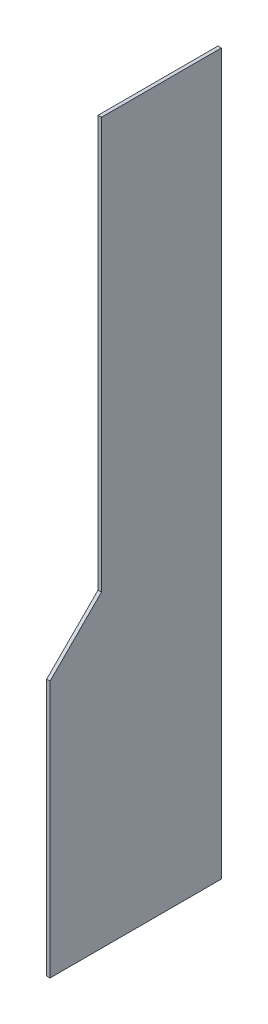
ISO-10303-21;
HEADER;
FILE_DESCRIPTION(('STEP AP214'),'2;1');
FILE_NAME('part.step','',(''),(''),'','','');
FILE_SCHEMA(('AUTOMOTIVE_DESIGN { 1 0 10303 214 1 1 1 1 }'));
ENDSEC;
DATA;
#1=APPLICATION_CONTEXT('core data for automotive mechanical design processes');
#2=APPLICATION_PROTOCOL_DEFINITION('international standard','automotive_design',2000,#1);
#3=PRODUCT_CONTEXT('',#1,'mechanical');
#4=PRODUCT('Part','Part','',(#3));
#5=PRODUCT_RELATED_PRODUCT_CATEGORY('part','',(#4));
#6=PRODUCT_DEFINITION_FORMATION('','',#4);
#7=PRODUCT_DEFINITION_CONTEXT('part definition',#1,'design');
#8=PRODUCT_DEFINITION('design','',#6,#7);
#9=PRODUCT_DEFINITION_SHAPE('','',#8);
#10=(LENGTH_UNIT() NAMED_UNIT(*) SI_UNIT(.MILLI.,.METRE.));
#11=(NAMED_UNIT(*) PLANE_ANGLE_UNIT() SI_UNIT($,.RADIAN.));
#12=(NAMED_UNIT(*) SI_UNIT($,.STERADIAN.) SOLID_ANGLE_UNIT());
#13=UNCERTAINTY_MEASURE_WITH_UNIT(LENGTH_MEASURE(1.E-05),#10,'distance_accuracy_value','');
#14=(GEOMETRIC_REPRESENTATION_CONTEXT(3) GLOBAL_UNCERTAINTY_ASSIGNED_CONTEXT((#13)) GLOBAL_UNIT_ASSIGNED_CONTEXT((#10,
#11,#12)) REPRESENTATION_CONTEXT('',''));
#15=CARTESIAN_POINT('',(0.,0.,0.));
#16=DIRECTION('',(0.,0.,1.));
#17=DIRECTION('',(1.,0.,0.));
#18=AXIS2_PLACEMENT_3D('',#15,#16,#17);
#19=CARTESIAN_POINT('',(10.,0.,0.));
#20=DIRECTION('',(0.,0.,-1.));
#21=DIRECTION('',(-1.,0.,0.));
#22=AXIS2_PLACEMENT_3D('',#19,#20,#21);
#23=PLANE('',#22);
#24=DIRECTION('',(0.,-1.,0.));
#25=VECTOR('',#24,1.);
#26=CARTESIAN_POINT('',(0.,0.,0.));
#27=LINE('',#26,#25);
#28=CARTESIAN_POINT('',(0.,750.,0.));
#29=VERTEX_POINT('',#28);
#30=CARTESIAN_POINT('',(0.,0.,0.));
#31=VERTEX_POINT('',#30);
#32=EDGE_CURVE('E118',#29,#31,#27,.T.);
#33=ORIENTED_EDGE('',*,*,#32,.T.);
#34=DIRECTION('',(-1.,0.,0.));
#35=VECTOR('',#34,1.);
#36=CARTESIAN_POINT('',(10.,0.,0.));
#37=LINE('',#36,#35);
#38=CARTESIAN_POINT('',(10.,0.,0.));
#39=VERTEX_POINT('',#38);
#40=EDGE_CURVE('E11',#39,#31,#37,.T.);
#41=ORIENTED_EDGE('',*,*,#40,.F.);
#42=DIRECTION('',(0.,-1.,0.));
#43=VECTOR('',#42,1.);
#44=CARTESIAN_POINT('',(10.,0.,0.));
#45=LINE('',#44,#43);
#46=CARTESIAN_POINT('',(10.,750.,0.));
#47=VERTEX_POINT('',#46);
#48=EDGE_CURVE('E129',#47,#39,#45,.T.);
#49=ORIENTED_EDGE('',*,*,#48,.F.);
#50=DIRECTION('',(-1.,0.,0.));
#51=VECTOR('',#50,1.);
#52=CARTESIAN_POINT('',(10.,750.,0.));
#53=LINE('',#52,#51);
#54=EDGE_CURVE('E114',#47,#29,#53,.T.);
#55=ORIENTED_EDGE('',*,*,#54,.T.);
#56=EDGE_LOOP('',(#33,#41,#49,#55));
#57=FACE_BOUND('',#56,.T.);
#58=ADVANCED_FACE('F35',(#57),#23,.F.);
#59=CARTESIAN_POINT('',(10.,0.,0.));
#60=DIRECTION('',(0.,1.,0.));
#61=DIRECTION('',(0.,0.,1.));
#62=AXIS2_PLACEMENT_3D('',#59,#60,#61);
#63=PLANE('',#62);
#64=DIRECTION('',(0.,0.,-1.));
#65=VECTOR('',#64,1.);
#66=CARTESIAN_POINT('',(0.,0.,0.));
#67=LINE('',#66,#65);
#68=CARTESIAN_POINT('',(0.,0.,-500.));
#69=VERTEX_POINT('',#68);
#70=EDGE_CURVE('E121',#31,#69,#67,.T.);
#71=ORIENTED_EDGE('',*,*,#70,.T.);
#72=DIRECTION('',(-1.,0.,0.));
#73=VECTOR('',#72,1.);
#74=CARTESIAN_POINT('',(10.,0.,-500.));
#75=LINE('',#74,#73);
#76=CARTESIAN_POINT('',(10.,0.,-500.));
#77=VERTEX_POINT('',#76);
#78=EDGE_CURVE('E43',#77,#69,#75,.T.);
#79=ORIENTED_EDGE('',*,*,#78,.F.);
#80=DIRECTION('',(0.,0.,-1.));
#81=VECTOR('',#80,1.);
#82=CARTESIAN_POINT('',(10.,0.,0.));
#83=LINE('',#82,#81);
#84=EDGE_CURVE('E87',#39,#77,#83,.T.);
#85=ORIENTED_EDGE('',*,*,#84,.F.);
#86=ORIENTED_EDGE('',*,*,#40,.T.);
#87=EDGE_LOOP('',(#71,#79,#85,#86));
#88=FACE_BOUND('',#87,.T.);
#89=ADVANCED_FACE('F153',(#88),#63,.F.);
#90=CARTESIAN_POINT('',(10.,0.,-500.));
#91=DIRECTION('',(0.,0.,1.));
#92=DIRECTION('',(1.,0.,0.));
#93=AXIS2_PLACEMENT_3D('',#90,#91,#92);
#94=PLANE('',#93);
#95=DIRECTION('',(0.,1.,0.));
#96=VECTOR('',#95,1.);
#97=CARTESIAN_POINT('',(0.,0.,-500.));
#98=LINE('',#97,#96);
#99=CARTESIAN_POINT('',(0.,2100.,-500.));
#100=VERTEX_POINT('',#99);
#101=EDGE_CURVE('E123',#69,#100,#98,.T.);
#102=ORIENTED_EDGE('',*,*,#101,.T.);
#103=DIRECTION('',(-1.,0.,0.));
#104=VECTOR('',#103,1.);
#105=CARTESIAN_POINT('',(10.,2100.,-500.));
#106=LINE('',#105,#104);
#107=CARTESIAN_POINT('',(10.,2100.,-500.));
#108=VERTEX_POINT('',#107);
#109=EDGE_CURVE('E109',#108,#100,#106,.T.);
#110=ORIENTED_EDGE('',*,*,#109,.F.);
#111=DIRECTION('',(0.,1.,0.));
#112=VECTOR('',#111,1.);
#113=CARTESIAN_POINT('',(10.,0.,-500.));
#114=LINE('',#113,#112);
#115=EDGE_CURVE('E100',#77,#108,#114,.T.);
#116=ORIENTED_EDGE('',*,*,#115,.F.);
#117=ORIENTED_EDGE('',*,*,#78,.T.);
#118=EDGE_LOOP('',(#102,#110,#116,#117));
#119=FACE_BOUND('',#118,.T.);
#120=ADVANCED_FACE('F135',(#119),#94,.F.);
#121=CARTESIAN_POINT('',(10.,2100.,-250.));
#122=DIRECTION('',(0.,-1.,0.));
#123=DIRECTION('',(0.,0.,-1.));
#124=AXIS2_PLACEMENT_3D('',#121,#122,#123);
#125=PLANE('',#124);
#126=DIRECTION('',(0.,0.,1.));
#127=VECTOR('',#126,1.);
#128=CARTESIAN_POINT('',(0.,2100.,-250.));
#129=LINE('',#128,#127);
#130=CARTESIAN_POINT('',(0.,2100.,-150.));
#131=VERTEX_POINT('',#130);
#132=EDGE_CURVE('E108',#100,#131,#129,.T.);
#133=ORIENTED_EDGE('',*,*,#132,.T.);
#134=DIRECTION('',(-1.,0.,0.));
#135=VECTOR('',#134,1.);
#136=CARTESIAN_POINT('',(10.,2100.,-150.));
#137=LINE('',#136,#135);
#138=CARTESIAN_POINT('',(10.,2100.,-150.));
#139=VERTEX_POINT('',#138);
#140=EDGE_CURVE('E106',#139,#131,#137,.T.);
#141=ORIENTED_EDGE('',*,*,#140,.F.);
#142=DIRECTION('',(0.,0.,1.));
#143=VECTOR('',#142,1.);
#144=CARTESIAN_POINT('',(10.,2100.,-250.));
#145=LINE('',#144,#143);
#146=EDGE_CURVE('E94',#108,#139,#145,.T.);
#147=ORIENTED_EDGE('',*,*,#146,.F.);
#148=ORIENTED_EDGE('',*,*,#109,.T.);
#149=EDGE_LOOP('',(#133,#141,#147,#148));
#150=FACE_BOUND('',#149,.T.);
#151=ADVANCED_FACE('F107',(#150),#125,.F.);
#152=CARTESIAN_POINT('',(10.,900.,-150.));
#153=DIRECTION('',(0.,0.,-1.));
#154=DIRECTION('',(-1.,0.,0.));
#155=AXIS2_PLACEMENT_3D('',#152,#153,#154);
#156=PLANE('',#155);
#157=DIRECTION('',(0.,-1.,0.));
#158=VECTOR('',#157,1.);
#159=CARTESIAN_POINT('',(0.,900.,-150.));
#160=LINE('',#159,#158);
#161=CARTESIAN_POINT('',(0.,900.,-150.));
#162=VERTEX_POINT('',#161);
#163=EDGE_CURVE('E73',#131,#162,#160,.T.);
#164=ORIENTED_EDGE('',*,*,#163,.T.);
#165=DIRECTION('',(-1.,0.,0.));
#166=VECTOR('',#165,1.);
#167=CARTESIAN_POINT('',(10.,900.,-150.));
#168=LINE('',#167,#166);
#169=CARTESIAN_POINT('',(10.,900.,-150.));
#170=VERTEX_POINT('',#169);
#171=EDGE_CURVE('E110',#170,#162,#168,.T.);
#172=ORIENTED_EDGE('',*,*,#171,.F.);
#173=DIRECTION('',(0.,-1.,0.));
#174=VECTOR('',#173,1.);
#175=CARTESIAN_POINT('',(10.,2100.,-150.));
#176=LINE('',#175,#174);
#177=EDGE_CURVE('E98',#139,#170,#176,.T.);
#178=ORIENTED_EDGE('',*,*,#177,.F.);
#179=ORIENTED_EDGE('',*,*,#140,.T.);
#180=EDGE_LOOP('',(#164,#172,#178,#179));
#181=FACE_BOUND('',#180,.T.);
#182=ADVANCED_FACE('F112',(#181),#156,.F.);
#183=CARTESIAN_POINT('',(10.,750.,0.));
#184=DIRECTION('',(0.,-0.707106781186547,-0.707106781186548));
#185=DIRECTION('',(0.,0.707106781186548,-0.707106781186547));
#186=AXIS2_PLACEMENT_3D('',#183,#184,#185);
#187=PLANE('',#186);
#188=DIRECTION('',(0.,-0.707106781186548,0.707106781186547));
#189=VECTOR('',#188,1.);
#190=CARTESIAN_POINT('',(0.,750.,0.));
#191=LINE('',#190,#189);
#192=EDGE_CURVE('E79',#162,#29,#191,.T.);
#193=ORIENTED_EDGE('',*,*,#192,.T.);
#194=ORIENTED_EDGE('',*,*,#54,.F.);
#195=DIRECTION('',(0.,-0.707106781186548,0.707106781186547));
#196=VECTOR('',#195,1.);
#197=CARTESIAN_POINT('',(10.,750.,0.));
#198=LINE('',#197,#196);
#199=EDGE_CURVE('E51',#170,#47,#198,.T.);
#200=ORIENTED_EDGE('',*,*,#199,.F.);
#201=ORIENTED_EDGE('',*,*,#171,.T.);
#202=EDGE_LOOP('',(#193,#194,#200,#201));
#203=FACE_BOUND('',#202,.T.);
#204=ADVANCED_FACE('F142',(#203),#187,.F.);
#205=CARTESIAN_POINT('',(10.,0.,0.));
#206=DIRECTION('',(1.,0.,0.));
#207=DIRECTION('',(0.,0.,-1.));
#208=AXIS2_PLACEMENT_3D('',#205,#206,#207);
#209=PLANE('',#208);
#210=ORIENTED_EDGE('',*,*,#48,.T.);
#211=ORIENTED_EDGE('',*,*,#84,.T.);
#212=ORIENTED_EDGE('',*,*,#115,.T.);
#213=ORIENTED_EDGE('',*,*,#146,.T.);
#214=ORIENTED_EDGE('',*,*,#177,.T.);
#215=ORIENTED_EDGE('',*,*,#199,.T.);
#216=EDGE_LOOP('',(#210,#211,#212,#213,#214,#215));
#217=FACE_BOUND('',#216,.T.);
#218=ADVANCED_FACE('F96',(#217),#209,.T.);
#219=CARTESIAN_POINT('',(0.,0.,0.));
#220=DIRECTION('',(1.,0.,0.));
#221=DIRECTION('',(0.,0.,-1.));
#222=AXIS2_PLACEMENT_3D('',#219,#220,#221);
#223=PLANE('',#222);
#224=ORIENTED_EDGE('',*,*,#32,.F.);
#225=ORIENTED_EDGE('',*,*,#192,.F.);
#226=ORIENTED_EDGE('',*,*,#163,.F.);
#227=ORIENTED_EDGE('',*,*,#132,.F.);
#228=ORIENTED_EDGE('',*,*,#101,.F.);
#229=ORIENTED_EDGE('',*,*,#70,.F.);
#230=EDGE_LOOP('',(#224,#225,#226,#227,#228,#229));
#231=FACE_BOUND('',#230,.T.);
#232=ADVANCED_FACE('F138',(#231),#223,.F.);
#233=CLOSED_SHELL('',(#58,#89,#120,#151,#182,#204,#218,#232));
#234=MANIFOLD_SOLID_BREP('B2',#233);
#235=ADVANCED_BREP_SHAPE_REPRESENTATION('',(#18,#234),#14);
#236=SHAPE_DEFINITION_REPRESENTATION(#9,#235);
ENDSEC;
END-ISO-10303-21;
